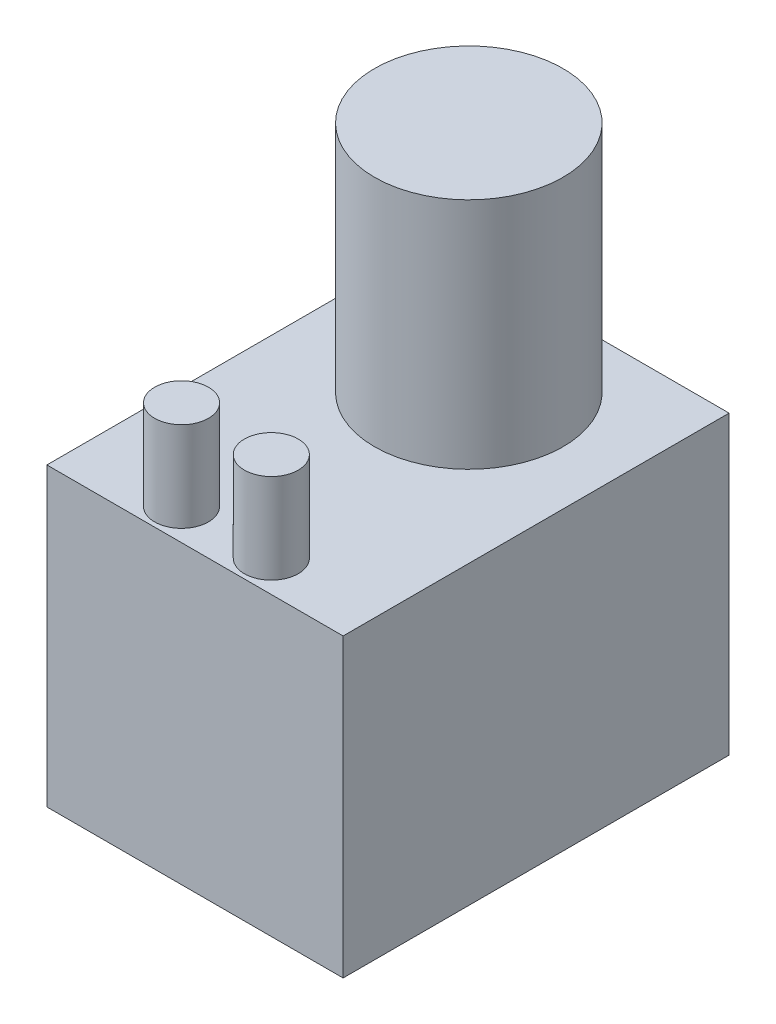
ISO-10303-21;
HEADER;
FILE_DESCRIPTION(('STEP AP214'),'2;1');
FILE_NAME('part.step','',(''),(''),'','','');
FILE_SCHEMA(('AUTOMOTIVE_DESIGN { 1 0 10303 214 1 1 1 1 }'));
ENDSEC;
DATA;
#1=APPLICATION_CONTEXT('core data for automotive mechanical design processes');
#2=APPLICATION_PROTOCOL_DEFINITION('international standard','automotive_design',2000,#1);
#3=PRODUCT_CONTEXT('',#1,'mechanical');
#4=PRODUCT('Part','Part','',(#3));
#5=PRODUCT_RELATED_PRODUCT_CATEGORY('part','',(#4));
#6=PRODUCT_DEFINITION_FORMATION('','',#4);
#7=PRODUCT_DEFINITION_CONTEXT('part definition',#1,'design');
#8=PRODUCT_DEFINITION('design','',#6,#7);
#9=PRODUCT_DEFINITION_SHAPE('','',#8);
#10=(LENGTH_UNIT() NAMED_UNIT(*) SI_UNIT(.MILLI.,.METRE.));
#11=(NAMED_UNIT(*) PLANE_ANGLE_UNIT() SI_UNIT($,.RADIAN.));
#12=(NAMED_UNIT(*) SI_UNIT($,.STERADIAN.) SOLID_ANGLE_UNIT());
#13=UNCERTAINTY_MEASURE_WITH_UNIT(LENGTH_MEASURE(1.E-05),#10,'distance_accuracy_value','');
#14=(GEOMETRIC_REPRESENTATION_CONTEXT(3) GLOBAL_UNCERTAINTY_ASSIGNED_CONTEXT((#13)) GLOBAL_UNIT_ASSIGNED_CONTEXT((#10,
#11,#12)) REPRESENTATION_CONTEXT('',''));
#15=CARTESIAN_POINT('',(0.,0.,0.));
#16=DIRECTION('',(0.,0.,1.));
#17=DIRECTION('',(1.,0.,0.));
#18=AXIS2_PLACEMENT_3D('',#15,#16,#17);
#19=CARTESIAN_POINT('',(33.,33.,86.));
#20=DIRECTION('',(-1.,0.,0.));
#21=DIRECTION('',(0.,-1.,0.));
#22=AXIS2_PLACEMENT_3D('',#19,#20,#21);
#23=PLANE('',#22);
#24=DIRECTION('',(0.,1.,0.));
#25=VECTOR('',#24,1.);
#26=CARTESIAN_POINT('',(33.,33.,0.));
#27=LINE('',#26,#25);
#28=CARTESIAN_POINT('',(33.,-33.,0.));
#29=VERTEX_POINT('',#28);
#30=CARTESIAN_POINT('',(33.,33.,0.));
#31=VERTEX_POINT('',#30);
#32=EDGE_CURVE('E104',#29,#31,#27,.T.);
#33=ORIENTED_EDGE('',*,*,#32,.T.);
#34=DIRECTION('',(0.,0.,-1.));
#35=VECTOR('',#34,1.);
#36=CARTESIAN_POINT('',(33.,33.,86.));
#37=LINE('',#36,#35);
#38=CARTESIAN_POINT('',(33.,33.,86.));
#39=VERTEX_POINT('',#38);
#40=EDGE_CURVE('E95',#39,#31,#37,.T.);
#41=ORIENTED_EDGE('',*,*,#40,.F.);
#42=DIRECTION('',(0.,1.,0.));
#43=VECTOR('',#42,1.);
#44=CARTESIAN_POINT('',(33.,33.,86.));
#45=LINE('',#44,#43);
#46=CARTESIAN_POINT('',(33.,-33.,86.));
#47=VERTEX_POINT('',#46);
#48=EDGE_CURVE('E89',#47,#39,#45,.T.);
#49=ORIENTED_EDGE('',*,*,#48,.F.);
#50=DIRECTION('',(0.,0.,-1.));
#51=VECTOR('',#50,1.);
#52=CARTESIAN_POINT('',(33.,-33.,86.));
#53=LINE('',#52,#51);
#54=EDGE_CURVE('E100',#47,#29,#53,.T.);
#55=ORIENTED_EDGE('',*,*,#54,.T.);
#56=EDGE_LOOP('',(#33,#41,#49,#55));
#57=FACE_BOUND('',#56,.T.);
#58=ADVANCED_FACE('F37',(#57),#23,.F.);
#59=CARTESIAN_POINT('',(-33.,33.,86.));
#60=DIRECTION('',(0.,-1.,0.));
#61=DIRECTION('',(0.,0.,-1.));
#62=AXIS2_PLACEMENT_3D('',#59,#60,#61);
#63=PLANE('',#62);
#64=CARTESIAN_POINT('',(10.,33.,79.));
#65=DIRECTION('',(0.,-1.,0.));
#66=DIRECTION('',(0.,0.,-1.));
#67=AXIS2_PLACEMENT_3D('',#64,#65,#66);
#68=CIRCLE('',#67,6.);
#69=CARTESIAN_POINT('',(10.,33.,73.));
#70=VERTEX_POINT('',#69);
#71=EDGE_CURVE('E11',#70,#70,#68,.F.);
#72=ORIENTED_EDGE('',*,*,#71,.F.);
#73=EDGE_LOOP('',(#72));
#74=FACE_BOUND('',#73,.T.);
#75=CARTESIAN_POINT('',(-10.,33.,79.));
#76=DIRECTION('',(0.,-1.,0.));
#77=DIRECTION('',(0.,0.,-1.));
#78=AXIS2_PLACEMENT_3D('',#75,#76,#77);
#79=CIRCLE('',#78,6.00000000000001);
#80=CARTESIAN_POINT('',(-10.,33.,73.));
#81=VERTEX_POINT('',#80);
#82=EDGE_CURVE('E45',#81,#81,#79,.F.);
#83=ORIENTED_EDGE('',*,*,#82,.F.);
#84=EDGE_LOOP('',(#83));
#85=FACE_BOUND('',#84,.T.);
#86=CARTESIAN_POINT('',(0.,33.,25.));
#87=DIRECTION('',(0.,1.,0.));
#88=DIRECTION('',(0.,0.,1.));
#89=AXIS2_PLACEMENT_3D('',#86,#87,#88);
#90=CIRCLE('',#89,21.);
#91=CARTESIAN_POINT('',(0.,33.,46.));
#92=VERTEX_POINT('',#91);
#93=EDGE_CURVE('E113',#92,#92,#90,.T.);
#94=ORIENTED_EDGE('',*,*,#93,.F.);
#95=EDGE_LOOP('',(#94));
#96=FACE_BOUND('',#95,.T.);
#97=DIRECTION('',(-1.,0.,0.));
#98=VECTOR('',#97,1.);
#99=CARTESIAN_POINT('',(-33.,33.,0.));
#100=LINE('',#99,#98);
#101=CARTESIAN_POINT('',(-33.,33.,0.));
#102=VERTEX_POINT('',#101);
#103=EDGE_CURVE('E94',#31,#102,#100,.T.);
#104=ORIENTED_EDGE('',*,*,#103,.T.);
#105=DIRECTION('',(0.,0.,-1.));
#106=VECTOR('',#105,1.);
#107=CARTESIAN_POINT('',(-33.,33.,86.));
#108=LINE('',#107,#106);
#109=CARTESIAN_POINT('',(-33.,33.,86.));
#110=VERTEX_POINT('',#109);
#111=EDGE_CURVE('E92',#110,#102,#108,.T.);
#112=ORIENTED_EDGE('',*,*,#111,.F.);
#113=DIRECTION('',(-1.,0.,0.));
#114=VECTOR('',#113,1.);
#115=CARTESIAN_POINT('',(-33.,33.,86.));
#116=LINE('',#115,#114);
#117=EDGE_CURVE('E84',#39,#110,#116,.T.);
#118=ORIENTED_EDGE('',*,*,#117,.F.);
#119=ORIENTED_EDGE('',*,*,#40,.T.);
#120=EDGE_LOOP('',(#104,#112,#118,#119));
#121=FACE_BOUND('',#120,.T.);
#122=ADVANCED_FACE('F93',(#74,#85,#96,#121),#63,.F.);
#123=CARTESIAN_POINT('',(-33.,33.,86.));
#124=DIRECTION('',(1.,0.,0.));
#125=DIRECTION('',(0.,1.,0.));
#126=AXIS2_PLACEMENT_3D('',#123,#124,#125);
#127=PLANE('',#126);
#128=DIRECTION('',(0.,-1.,0.));
#129=VECTOR('',#128,1.);
#130=CARTESIAN_POINT('',(-33.,33.,0.));
#131=LINE('',#130,#129);
#132=CARTESIAN_POINT('',(-33.,-33.,0.));
#133=VERTEX_POINT('',#132);
#134=EDGE_CURVE('E70',#102,#133,#131,.T.);
#135=ORIENTED_EDGE('',*,*,#134,.T.);
#136=DIRECTION('',(0.,0.,-1.));
#137=VECTOR('',#136,1.);
#138=CARTESIAN_POINT('',(-33.,-33.,86.));
#139=LINE('',#138,#137);
#140=CARTESIAN_POINT('',(-33.,-33.,86.));
#141=VERTEX_POINT('',#140);
#142=EDGE_CURVE('E96',#141,#133,#139,.T.);
#143=ORIENTED_EDGE('',*,*,#142,.F.);
#144=DIRECTION('',(0.,-1.,0.));
#145=VECTOR('',#144,1.);
#146=CARTESIAN_POINT('',(-33.,33.,86.));
#147=LINE('',#146,#145);
#148=EDGE_CURVE('E87',#110,#141,#147,.T.);
#149=ORIENTED_EDGE('',*,*,#148,.F.);
#150=ORIENTED_EDGE('',*,*,#111,.T.);
#151=EDGE_LOOP('',(#135,#143,#149,#150));
#152=FACE_BOUND('',#151,.T.);
#153=ADVANCED_FACE('F98',(#152),#127,.F.);
#154=CARTESIAN_POINT('',(-33.,-33.,86.));
#155=DIRECTION('',(0.,1.,0.));
#156=DIRECTION('',(0.,0.,1.));
#157=AXIS2_PLACEMENT_3D('',#154,#155,#156);
#158=PLANE('',#157);
#159=DIRECTION('',(1.,0.,0.));
#160=VECTOR('',#159,1.);
#161=CARTESIAN_POINT('',(-33.,-33.,0.));
#162=LINE('',#161,#160);
#163=EDGE_CURVE('E76',#133,#29,#162,.T.);
#164=ORIENTED_EDGE('',*,*,#163,.T.);
#165=ORIENTED_EDGE('',*,*,#54,.F.);
#166=DIRECTION('',(1.,0.,0.));
#167=VECTOR('',#166,1.);
#168=CARTESIAN_POINT('',(-33.,-33.,86.));
#169=LINE('',#168,#167);
#170=EDGE_CURVE('E53',#141,#47,#169,.T.);
#171=ORIENTED_EDGE('',*,*,#170,.F.);
#172=ORIENTED_EDGE('',*,*,#142,.T.);
#173=EDGE_LOOP('',(#164,#165,#171,#172));
#174=FACE_BOUND('',#173,.T.);
#175=ADVANCED_FACE('F147',(#174),#158,.F.);
#176=CARTESIAN_POINT('',(0.,0.,86.));
#177=DIRECTION('',(0.,0.,1.));
#178=DIRECTION('',(1.,0.,0.));
#179=AXIS2_PLACEMENT_3D('',#176,#177,#178);
#180=PLANE('',#179);
#181=ORIENTED_EDGE('',*,*,#48,.T.);
#182=ORIENTED_EDGE('',*,*,#117,.T.);
#183=ORIENTED_EDGE('',*,*,#148,.T.);
#184=ORIENTED_EDGE('',*,*,#170,.T.);
#185=EDGE_LOOP('',(#181,#182,#183,#184));
#186=FACE_BOUND('',#185,.T.);
#187=ADVANCED_FACE('F85',(#186),#180,.T.);
#188=CARTESIAN_POINT('',(0.,0.,0.));
#189=DIRECTION('',(0.,0.,1.));
#190=DIRECTION('',(1.,0.,0.));
#191=AXIS2_PLACEMENT_3D('',#188,#189,#190);
#192=PLANE('',#191);
#193=ORIENTED_EDGE('',*,*,#32,.F.);
#194=ORIENTED_EDGE('',*,*,#163,.F.);
#195=ORIENTED_EDGE('',*,*,#134,.F.);
#196=ORIENTED_EDGE('',*,*,#103,.F.);
#197=EDGE_LOOP('',(#193,#194,#195,#196));
#198=FACE_BOUND('',#197,.T.);
#199=ADVANCED_FACE('F153',(#198),#192,.F.);
#200=CARTESIAN_POINT('',(0.,85.,25.));
#201=DIRECTION('',(0.,-1.,0.));
#202=DIRECTION('',(0.,0.,-1.));
#203=AXIS2_PLACEMENT_3D('',#200,#201,#202);
#204=CYLINDRICAL_SURFACE('',#203,21.);
#205=CARTESIAN_POINT('',(0.,85.,25.));
#206=DIRECTION('',(0.,1.,0.));
#207=DIRECTION('',(0.,0.,1.));
#208=AXIS2_PLACEMENT_3D('',#205,#206,#207);
#209=CIRCLE('',#208,21.);
#210=CARTESIAN_POINT('',(0.,85.,46.));
#211=VERTEX_POINT('',#210);
#212=EDGE_CURVE('E107',#211,#211,#209,.T.);
#213=ORIENTED_EDGE('',*,*,#212,.F.);
#214=EDGE_LOOP('',(#213));
#215=FACE_BOUND('',#214,.T.);
#216=ORIENTED_EDGE('',*,*,#93,.T.);
#217=EDGE_LOOP('',(#216));
#218=FACE_BOUND('',#217,.T.);
#219=ADVANCED_FACE('F156',(#215,#218),#204,.T.);
#220=CARTESIAN_POINT('',(0.,85.,25.));
#221=DIRECTION('',(0.,1.,0.));
#222=DIRECTION('',(0.,0.,1.));
#223=AXIS2_PLACEMENT_3D('',#220,#221,#222);
#224=PLANE('',#223);
#225=ORIENTED_EDGE('',*,*,#212,.T.);
#226=EDGE_LOOP('',(#225));
#227=FACE_BOUND('',#226,.T.);
#228=ADVANCED_FACE('F162',(#227),#224,.T.);
#229=CARTESIAN_POINT('',(-10.,53.,79.));
#230=DIRECTION('',(0.,-1.,0.));
#231=DIRECTION('',(0.,0.,-1.));
#232=AXIS2_PLACEMENT_3D('',#229,#230,#231);
#233=CYLINDRICAL_SURFACE('',#232,6.00000000000001);
#234=CARTESIAN_POINT('',(-10.,53.,79.));
#235=DIRECTION('',(0.,1.,0.));
#236=DIRECTION('',(0.,0.,1.));
#237=AXIS2_PLACEMENT_3D('',#234,#235,#236);
#238=CIRCLE('',#237,6.00000000000001);
#239=CARTESIAN_POINT('',(-10.,53.,85.));
#240=VERTEX_POINT('',#239);
#241=EDGE_CURVE('E124',#240,#240,#238,.T.);
#242=ORIENTED_EDGE('',*,*,#241,.F.);
#243=EDGE_LOOP('',(#242));
#244=FACE_BOUND('',#243,.T.);
#245=ORIENTED_EDGE('',*,*,#82,.T.);
#246=EDGE_LOOP('',(#245));
#247=FACE_BOUND('',#246,.T.);
#248=ADVANCED_FACE('F166',(#244,#247),#233,.T.);
#249=CARTESIAN_POINT('',(-10.,53.,79.));
#250=DIRECTION('',(0.,1.,0.));
#251=DIRECTION('',(0.,0.,1.));
#252=AXIS2_PLACEMENT_3D('',#249,#250,#251);
#253=PLANE('',#252);
#254=ORIENTED_EDGE('',*,*,#241,.T.);
#255=EDGE_LOOP('',(#254));
#256=FACE_BOUND('',#255,.T.);
#257=ADVANCED_FACE('F136',(#256),#253,.T.);
#258=CARTESIAN_POINT('',(10.,53.,79.));
#259=DIRECTION('',(0.,-1.,0.));
#260=DIRECTION('',(0.,0.,-1.));
#261=AXIS2_PLACEMENT_3D('',#258,#259,#260);
#262=CYLINDRICAL_SURFACE('',#261,6.);
#263=CARTESIAN_POINT('',(10.,53.,79.));
#264=DIRECTION('',(0.,1.,0.));
#265=DIRECTION('',(0.,0.,1.));
#266=AXIS2_PLACEMENT_3D('',#263,#264,#265);
#267=CIRCLE('',#266,6.);
#268=CARTESIAN_POINT('',(10.,53.,85.));
#269=VERTEX_POINT('',#268);
#270=EDGE_CURVE('E127',#269,#269,#267,.T.);
#271=ORIENTED_EDGE('',*,*,#270,.F.);
#272=EDGE_LOOP('',(#271));
#273=FACE_BOUND('',#272,.T.);
#274=ORIENTED_EDGE('',*,*,#71,.T.);
#275=EDGE_LOOP('',(#274));
#276=FACE_BOUND('',#275,.T.);
#277=ADVANCED_FACE('F133',(#273,#276),#262,.T.);
#278=CARTESIAN_POINT('',(10.,53.,79.));
#279=DIRECTION('',(0.,1.,0.));
#280=DIRECTION('',(0.,0.,1.));
#281=AXIS2_PLACEMENT_3D('',#278,#279,#280);
#282=PLANE('',#281);
#283=ORIENTED_EDGE('',*,*,#270,.T.);
#284=EDGE_LOOP('',(#283));
#285=FACE_BOUND('',#284,.T.);
#286=ADVANCED_FACE('F131',(#285),#282,.T.);
#287=CLOSED_SHELL('',(#58,#122,#153,#175,#187,#199,#219,#228,#248,#257,#277,#286));
#288=MANIFOLD_SOLID_BREP('B2',#287);
#289=ADVANCED_BREP_SHAPE_REPRESENTATION('',(#18,#288),#14);
#290=SHAPE_DEFINITION_REPRESENTATION(#9,#289);
ENDSEC;
END-ISO-10303-21;
